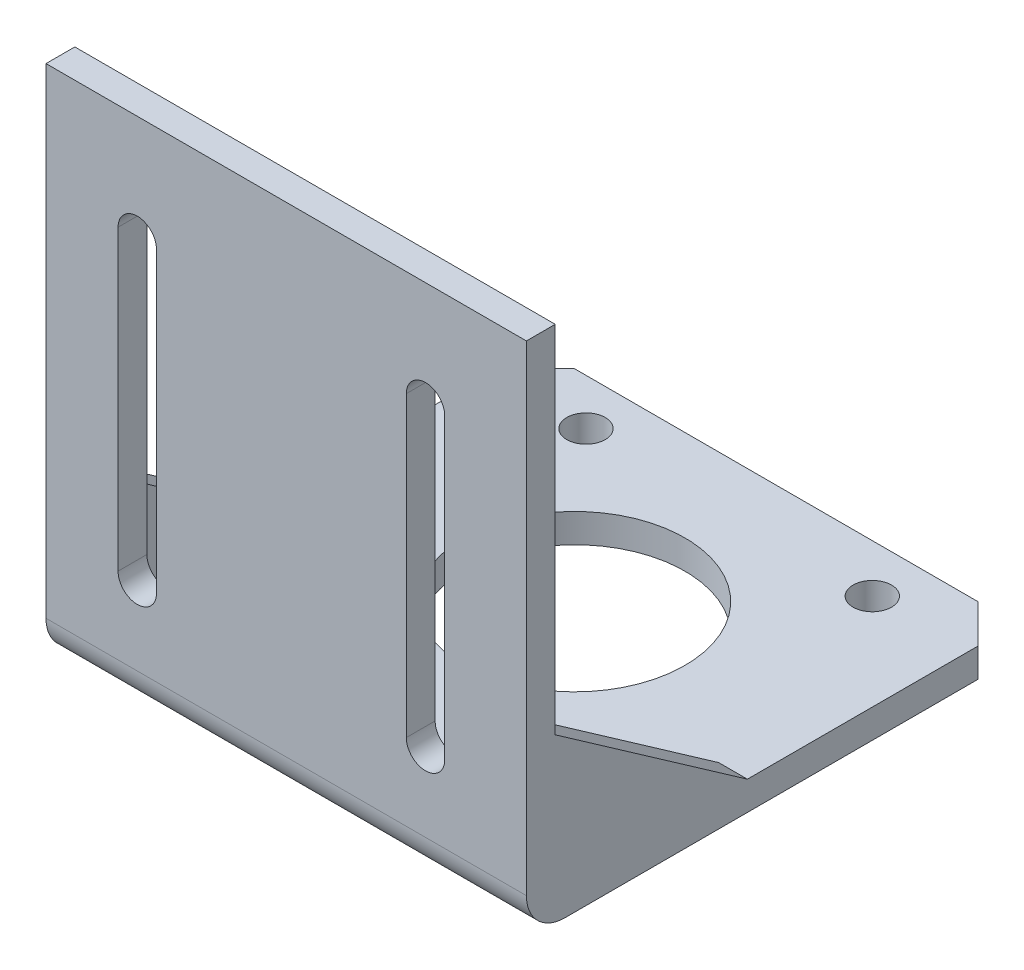
ISO-10303-21;
HEADER;
FILE_DESCRIPTION(('STEP AP214'),'2;1');
FILE_NAME('part.step','',(''),(''),'','','');
FILE_SCHEMA(('AUTOMOTIVE_DESIGN { 1 0 10303 214 1 1 1 1 }'));
ENDSEC;
DATA;
#1=APPLICATION_CONTEXT('core data for automotive mechanical design processes');
#2=APPLICATION_PROTOCOL_DEFINITION('international standard','automotive_design',2000,#1);
#3=PRODUCT_CONTEXT('',#1,'mechanical');
#4=PRODUCT('Part','Part','',(#3));
#5=PRODUCT_RELATED_PRODUCT_CATEGORY('part','',(#4));
#6=PRODUCT_DEFINITION_FORMATION('','',#4);
#7=PRODUCT_DEFINITION_CONTEXT('part definition',#1,'design');
#8=PRODUCT_DEFINITION('design','',#6,#7);
#9=PRODUCT_DEFINITION_SHAPE('','',#8);
#10=(LENGTH_UNIT() NAMED_UNIT(*) SI_UNIT(.MILLI.,.METRE.));
#11=(NAMED_UNIT(*) PLANE_ANGLE_UNIT() SI_UNIT($,.RADIAN.));
#12=(NAMED_UNIT(*) SI_UNIT($,.STERADIAN.) SOLID_ANGLE_UNIT());
#13=UNCERTAINTY_MEASURE_WITH_UNIT(LENGTH_MEASURE(1.E-05),#10,'distance_accuracy_value','');
#14=(GEOMETRIC_REPRESENTATION_CONTEXT(3) GLOBAL_UNCERTAINTY_ASSIGNED_CONTEXT((#13)) GLOBAL_UNIT_ASSIGNED_CONTEXT((#10,
#11,#12)) REPRESENTATION_CONTEXT('',''));
#15=CARTESIAN_POINT('',(0.,0.,0.));
#16=DIRECTION('',(0.,0.,1.));
#17=DIRECTION('',(1.,0.,0.));
#18=AXIS2_PLACEMENT_3D('',#15,#16,#17);
#19=CARTESIAN_POINT('',(0.,3.,0.));
#20=DIRECTION('',(0.,1.,0.));
#21=DIRECTION('',(0.,0.,1.));
#22=AXIS2_PLACEMENT_3D('',#19,#20,#21);
#23=PLANE('',#22);
#24=CARTESIAN_POINT('',(15.,3.,12.202380952381));
#25=DIRECTION('',(0.,1.,0.));
#26=DIRECTION('',(0.,0.,1.));
#27=AXIS2_PLACEMENT_3D('',#24,#25,#26);
#28=CIRCLE('',#27,2.);
#29=CARTESIAN_POINT('',(15.,3.,14.202380952381));
#30=VERTEX_POINT('',#29);
#31=EDGE_CURVE('E368',#30,#30,#28,.T.);
#32=ORIENTED_EDGE('',*,*,#31,.F.);
#33=EDGE_LOOP('',(#32));
#34=FACE_BOUND('',#33,.T.);
#35=CARTESIAN_POINT('',(-15.,3.,-19.));
#36=DIRECTION('',(0.,1.,0.));
#37=DIRECTION('',(0.,0.,1.));
#38=AXIS2_PLACEMENT_3D('',#35,#36,#37);
#39=CIRCLE('',#38,2.);
#40=CARTESIAN_POINT('',(-15.,3.,-17.));
#41=VERTEX_POINT('',#40);
#42=EDGE_CURVE('E384',#41,#41,#39,.T.);
#43=ORIENTED_EDGE('',*,*,#42,.F.);
#44=EDGE_LOOP('',(#43));
#45=FACE_BOUND('',#44,.T.);
#46=CARTESIAN_POINT('',(0.,3.,-2.79761904761905));
#47=DIRECTION('',(0.,1.,0.));
#48=DIRECTION('',(0.,0.,1.));
#49=AXIS2_PLACEMENT_3D('',#46,#47,#48);
#50=CIRCLE('',#49,11.5);
#51=CARTESIAN_POINT('',(0.,3.,8.70238095238095));
#52=VERTEX_POINT('',#51);
#53=EDGE_CURVE('E392',#52,#52,#50,.T.);
#54=ORIENTED_EDGE('',*,*,#53,.F.);
#55=EDGE_LOOP('',(#54));
#56=FACE_BOUND('',#55,.T.);
#57=CARTESIAN_POINT('',(15.,3.,-18.797619047619));
#58=DIRECTION('',(0.,1.,0.));
#59=DIRECTION('',(0.,0.,1.));
#60=AXIS2_PLACEMENT_3D('',#57,#58,#59);
#61=CIRCLE('',#60,2.00000000000001);
#62=CARTESIAN_POINT('',(15.,3.,-16.797619047619));
#63=VERTEX_POINT('',#62);
#64=EDGE_CURVE('E376',#63,#63,#61,.T.);
#65=ORIENTED_EDGE('',*,*,#64,.F.);
#66=EDGE_LOOP('',(#65));
#67=FACE_BOUND('',#66,.T.);
#68=CARTESIAN_POINT('',(-15.,3.,12.202380952381));
#69=DIRECTION('',(0.,1.,0.));
#70=DIRECTION('',(0.,0.,1.));
#71=AXIS2_PLACEMENT_3D('',#68,#69,#70);
#72=CIRCLE('',#71,2.);
#73=CARTESIAN_POINT('',(-15.,3.,14.202380952381));
#74=VERTEX_POINT('',#73);
#75=EDGE_CURVE('E360',#74,#74,#72,.T.);
#76=ORIENTED_EDGE('',*,*,#75,.F.);
#77=EDGE_LOOP('',(#76));
#78=FACE_BOUND('',#77,.T.);
#79=DIRECTION('',(0.,0.,1.));
#80=VECTOR('',#79,1.);
#81=CARTESIAN_POINT('',(-25.,3.,-19.7976190476191));
#82=LINE('',#81,#80);
#83=CARTESIAN_POINT('',(-25.,3.,-19.7976190476191));
#84=VERTEX_POINT('',#83);
#85=CARTESIAN_POINT('',(-25.,3.,4.20238095238095));
#86=VERTEX_POINT('',#85);
#87=EDGE_CURVE('E413',#84,#86,#82,.T.);
#88=ORIENTED_EDGE('',*,*,#87,.T.);
#89=DIRECTION('',(-1.,0.,0.));
#90=VECTOR('',#89,1.);
#91=CARTESIAN_POINT('',(-22.,3.,4.20238095238095));
#92=LINE('',#91,#90);
#93=CARTESIAN_POINT('',(-22.,3.,4.20238095238095));
#94=VERTEX_POINT('',#93);
#95=EDGE_CURVE('E209',#94,#86,#92,.T.);
#96=ORIENTED_EDGE('',*,*,#95,.F.);
#97=DIRECTION('',(0.,0.,-1.));
#98=VECTOR('',#97,1.);
#99=CARTESIAN_POINT('',(-22.,3.,4.20238095238095));
#100=LINE('',#99,#98);
#101=CARTESIAN_POINT('',(-22.,3.,22.202380952381));
#102=VERTEX_POINT('',#101);
#103=EDGE_CURVE('E195',#102,#94,#100,.T.);
#104=ORIENTED_EDGE('',*,*,#103,.F.);
#105=DIRECTION('',(1.,0.,0.));
#106=VECTOR('',#105,1.);
#107=CARTESIAN_POINT('',(25.,3.,22.202380952381));
#108=LINE('',#107,#106);
#109=CARTESIAN_POINT('',(22.,3.,22.202380952381));
#110=VERTEX_POINT('',#109);
#111=EDGE_CURVE('E457',#102,#110,#108,.T.);
#112=ORIENTED_EDGE('',*,*,#111,.T.);
#113=DIRECTION('',(0.,0.,-1.));
#114=VECTOR('',#113,1.);
#115=CARTESIAN_POINT('',(22.,3.,4.20238095238095));
#116=LINE('',#115,#114);
#117=CARTESIAN_POINT('',(22.,3.,4.20238095238095));
#118=VERTEX_POINT('',#117);
#119=EDGE_CURVE('E226',#110,#118,#116,.T.);
#120=ORIENTED_EDGE('',*,*,#119,.T.);
#121=DIRECTION('',(1.,0.,0.));
#122=VECTOR('',#121,1.);
#123=CARTESIAN_POINT('',(22.,3.,4.20238095238095));
#124=LINE('',#123,#122);
#125=CARTESIAN_POINT('',(25.,3.,4.20238095238095));
#126=VERTEX_POINT('',#125);
#127=EDGE_CURVE('E236',#118,#126,#124,.T.);
#128=ORIENTED_EDGE('',*,*,#127,.T.);
#129=DIRECTION('',(0.,0.,-1.));
#130=VECTOR('',#129,1.);
#131=CARTESIAN_POINT('',(25.,3.,-19.7976190476191));
#132=LINE('',#131,#130);
#133=CARTESIAN_POINT('',(25.,3.,-19.7976190476191));
#134=VERTEX_POINT('',#133);
#135=EDGE_CURVE('E400',#126,#134,#132,.T.);
#136=ORIENTED_EDGE('',*,*,#135,.T.);
#137=DIRECTION('',(-0.707106781186548,0.,-0.707106781186548));
#138=VECTOR('',#137,1.);
#139=CARTESIAN_POINT('',(21.,3.,-23.7976190476191));
#140=LINE('',#139,#138);
#141=CARTESIAN_POINT('',(21.,3.,-23.7976190476191));
#142=VERTEX_POINT('',#141);
#143=EDGE_CURVE('E403',#134,#142,#140,.T.);
#144=ORIENTED_EDGE('',*,*,#143,.T.);
#145=DIRECTION('',(-1.,0.,0.));
#146=VECTOR('',#145,1.);
#147=CARTESIAN_POINT('',(-21.,3.,-23.7976190476191));
#148=LINE('',#147,#146);
#149=CARTESIAN_POINT('',(-21.,3.,-23.7976190476191));
#150=VERTEX_POINT('',#149);
#151=EDGE_CURVE('E407',#142,#150,#148,.T.);
#152=ORIENTED_EDGE('',*,*,#151,.T.);
#153=DIRECTION('',(-0.707106781186548,0.,0.707106781186548));
#154=VECTOR('',#153,1.);
#155=CARTESIAN_POINT('',(-25.,3.,-19.7976190476191));
#156=LINE('',#155,#154);
#157=EDGE_CURVE('E410',#150,#84,#156,.T.);
#158=ORIENTED_EDGE('',*,*,#157,.T.);
#159=EDGE_LOOP('',(#88,#96,#104,#112,#120,#128,#136,#144,#152,#158));
#160=FACE_BOUND('',#159,.T.);
#161=ADVANCED_FACE('F39',(#34,#45,#56,#67,#78,#160),#23,.T.);
#162=CARTESIAN_POINT('',(0.,0.,24.202380952381));
#163=DIRECTION('',(0.,0.,-1.));
#164=DIRECTION('',(-1.,0.,0.));
#165=AXIS2_PLACEMENT_3D('',#162,#163,#164);
#166=PLANE('',#165);
#167=DIRECTION('',(0.,1.,0.));
#168=VECTOR('',#167,1.);
#169=CARTESIAN_POINT('',(16.5,43.,24.202380952381));
#170=LINE('',#169,#168);
#171=CARTESIAN_POINT('',(16.5,12.,24.202380952381));
#172=VERTEX_POINT('',#171);
#173=CARTESIAN_POINT('',(16.5,43.,24.202380952381));
#174=VERTEX_POINT('',#173);
#175=EDGE_CURVE('E251',#172,#174,#170,.T.);
#176=ORIENTED_EDGE('',*,*,#175,.T.);
#177=CARTESIAN_POINT('',(14.5,43.,24.202380952381));
#178=DIRECTION('',(0.,0.,1.));
#179=DIRECTION('',(-1.,0.,0.));
#180=AXIS2_PLACEMENT_3D('',#177,#178,#179);
#181=CIRCLE('',#180,2.);
#182=CARTESIAN_POINT('',(12.5,43.,24.202380952381));
#183=VERTEX_POINT('',#182);
#184=EDGE_CURVE('E243',#174,#183,#181,.T.);
#185=ORIENTED_EDGE('',*,*,#184,.T.);
#186=DIRECTION('',(0.,-1.,0.));
#187=VECTOR('',#186,1.);
#188=CARTESIAN_POINT('',(12.5,43.,24.202380952381));
#189=LINE('',#188,#187);
#190=CARTESIAN_POINT('',(12.5,12.,24.202380952381));
#191=VERTEX_POINT('',#190);
#192=EDGE_CURVE('E265',#183,#191,#189,.T.);
#193=ORIENTED_EDGE('',*,*,#192,.T.);
#194=CARTESIAN_POINT('',(14.5,12.,24.202380952381));
#195=DIRECTION('',(0.,0.,1.));
#196=DIRECTION('',(1.,0.,0.));
#197=AXIS2_PLACEMENT_3D('',#194,#195,#196);
#198=CIRCLE('',#197,2.00000000000001);
#199=EDGE_CURVE('E269',#191,#172,#198,.T.);
#200=ORIENTED_EDGE('',*,*,#199,.T.);
#201=EDGE_LOOP('',(#176,#185,#193,#200));
#202=FACE_BOUND('',#201,.T.);
#203=DIRECTION('',(0.,1.,0.));
#204=VECTOR('',#203,1.);
#205=CARTESIAN_POINT('',(-13.5,43.,24.202380952381));
#206=LINE('',#205,#204);
#207=CARTESIAN_POINT('',(-13.5,12.,24.202380952381));
#208=VERTEX_POINT('',#207);
#209=CARTESIAN_POINT('',(-13.5,43.,24.202380952381));
#210=VERTEX_POINT('',#209);
#211=EDGE_CURVE('E294',#208,#210,#206,.T.);
#212=ORIENTED_EDGE('',*,*,#211,.T.);
#213=CARTESIAN_POINT('',(-15.5,43.,24.202380952381));
#214=DIRECTION('',(0.,0.,1.));
#215=DIRECTION('',(-1.,0.,0.));
#216=AXIS2_PLACEMENT_3D('',#213,#214,#215);
#217=CIRCLE('',#216,2.);
#218=CARTESIAN_POINT('',(-17.5,43.,24.202380952381));
#219=VERTEX_POINT('',#218);
#220=EDGE_CURVE('E289',#210,#219,#217,.T.);
#221=ORIENTED_EDGE('',*,*,#220,.T.);
#222=DIRECTION('',(0.,-1.,0.));
#223=VECTOR('',#222,1.);
#224=CARTESIAN_POINT('',(-17.5,43.,24.202380952381));
#225=LINE('',#224,#223);
#226=CARTESIAN_POINT('',(-17.5,12.,24.202380952381));
#227=VERTEX_POINT('',#226);
#228=EDGE_CURVE('E308',#219,#227,#225,.T.);
#229=ORIENTED_EDGE('',*,*,#228,.T.);
#230=CARTESIAN_POINT('',(-15.5,12.,24.202380952381));
#231=DIRECTION('',(0.,0.,1.));
#232=DIRECTION('',(1.,0.,0.));
#233=AXIS2_PLACEMENT_3D('',#230,#231,#232);
#234=CIRCLE('',#233,2.);
#235=EDGE_CURVE('E312',#227,#208,#234,.T.);
#236=ORIENTED_EDGE('',*,*,#235,.T.);
#237=EDGE_LOOP('',(#212,#221,#229,#236));
#238=FACE_BOUND('',#237,.T.);
#239=DIRECTION('',(0.,-1.,0.));
#240=VECTOR('',#239,1.);
#241=CARTESIAN_POINT('',(-22.,3.,24.202380952381));
#242=LINE('',#241,#240);
#243=CARTESIAN_POINT('',(-22.,17.,24.202380952381));
#244=VERTEX_POINT('',#243);
#245=CARTESIAN_POINT('',(-22.,5.,24.202380952381));
#246=VERTEX_POINT('',#245);
#247=EDGE_CURVE('E193',#244,#246,#242,.T.);
#248=ORIENTED_EDGE('',*,*,#247,.F.);
#249=DIRECTION('',(-1.,0.,0.));
#250=VECTOR('',#249,1.);
#251=CARTESIAN_POINT('',(-22.,17.,24.202380952381));
#252=LINE('',#251,#250);
#253=CARTESIAN_POINT('',(-25.,17.,24.202380952381));
#254=VERTEX_POINT('',#253);
#255=EDGE_CURVE('E200',#244,#254,#252,.T.);
#256=ORIENTED_EDGE('',*,*,#255,.T.);
#257=DIRECTION('',(0.,-1.,0.));
#258=VECTOR('',#257,1.);
#259=CARTESIAN_POINT('',(-25.,0.,24.202380952381));
#260=LINE('',#259,#258);
#261=CARTESIAN_POINT('',(-25.,54.,24.202380952381));
#262=VERTEX_POINT('',#261);
#263=EDGE_CURVE('E337',#262,#254,#260,.T.);
#264=ORIENTED_EDGE('',*,*,#263,.F.);
#265=DIRECTION('',(-1.,0.,0.));
#266=VECTOR('',#265,1.);
#267=CARTESIAN_POINT('',(-25.,54.,24.202380952381));
#268=LINE('',#267,#266);
#269=CARTESIAN_POINT('',(25.,54.,24.202380952381));
#270=VERTEX_POINT('',#269);
#271=EDGE_CURVE('E347',#270,#262,#268,.T.);
#272=ORIENTED_EDGE('',*,*,#271,.F.);
#273=DIRECTION('',(0.,1.,0.));
#274=VECTOR('',#273,1.);
#275=CARTESIAN_POINT('',(25.,54.,24.202380952381));
#276=LINE('',#275,#274);
#277=CARTESIAN_POINT('',(25.,17.,24.202380952381));
#278=VERTEX_POINT('',#277);
#279=EDGE_CURVE('E332',#278,#270,#276,.T.);
#280=ORIENTED_EDGE('',*,*,#279,.F.);
#281=DIRECTION('',(1.,0.,0.));
#282=VECTOR('',#281,1.);
#283=CARTESIAN_POINT('',(22.,17.,24.202380952381));
#284=LINE('',#283,#282);
#285=CARTESIAN_POINT('',(22.,17.,24.202380952381));
#286=VERTEX_POINT('',#285);
#287=EDGE_CURVE('E240',#286,#278,#284,.T.);
#288=ORIENTED_EDGE('',*,*,#287,.F.);
#289=DIRECTION('',(0.,-1.,0.));
#290=VECTOR('',#289,1.);
#291=CARTESIAN_POINT('',(22.,3.,24.202380952381));
#292=LINE('',#291,#290);
#293=CARTESIAN_POINT('',(22.,5.,24.202380952381));
#294=VERTEX_POINT('',#293);
#295=EDGE_CURVE('E233',#286,#294,#292,.T.);
#296=ORIENTED_EDGE('',*,*,#295,.T.);
#297=DIRECTION('',(1.,0.,0.));
#298=VECTOR('',#297,1.);
#299=CARTESIAN_POINT('',(-25.,5.,24.202380952381));
#300=LINE('',#299,#298);
#301=EDGE_CURVE('E215',#294,#246,#300,.F.);
#302=ORIENTED_EDGE('',*,*,#301,.T.);
#303=EDGE_LOOP('',(#248,#256,#264,#272,#280,#288,#296,#302));
#304=FACE_BOUND('',#303,.T.);
#305=ADVANCED_FACE('F212',(#202,#238,#304),#166,.T.);
#306=CARTESIAN_POINT('',(0.,0.,0.));
#307=DIRECTION('',(0.,1.,0.));
#308=DIRECTION('',(0.,0.,1.));
#309=AXIS2_PLACEMENT_3D('',#306,#307,#308);
#310=PLANE('',#309);
#311=DIRECTION('',(0.,0.,-1.));
#312=VECTOR('',#311,1.);
#313=CARTESIAN_POINT('',(25.,0.,-19.7976190476191));
#314=LINE('',#313,#312);
#315=CARTESIAN_POINT('',(25.,0.,23.2023809523809));
#316=VERTEX_POINT('',#315);
#317=CARTESIAN_POINT('',(25.,0.,-19.7976190476191));
#318=VERTEX_POINT('',#317);
#319=EDGE_CURVE('E396',#316,#318,#314,.T.);
#320=ORIENTED_EDGE('',*,*,#319,.F.);
#321=DIRECTION('',(1.,0.,0.));
#322=VECTOR('',#321,1.);
#323=CARTESIAN_POINT('',(0.,0.,23.2023809523809));
#324=LINE('',#323,#322);
#325=CARTESIAN_POINT('',(-25.,0.,23.2023809523809));
#326=VERTEX_POINT('',#325);
#327=EDGE_CURVE('E55',#316,#326,#324,.F.);
#328=ORIENTED_EDGE('',*,*,#327,.T.);
#329=DIRECTION('',(0.,0.,1.));
#330=VECTOR('',#329,1.);
#331=CARTESIAN_POINT('',(-25.,0.,-19.7976190476191));
#332=LINE('',#331,#330);
#333=CARTESIAN_POINT('',(-25.,0.,-19.7976190476191));
#334=VERTEX_POINT('',#333);
#335=EDGE_CURVE('E404',#334,#326,#332,.T.);
#336=ORIENTED_EDGE('',*,*,#335,.F.);
#337=DIRECTION('',(-0.707106781186548,0.,0.707106781186548));
#338=VECTOR('',#337,1.);
#339=CARTESIAN_POINT('',(-25.,0.,-19.7976190476191));
#340=LINE('',#339,#338);
#341=CARTESIAN_POINT('',(-21.,0.,-23.7976190476191));
#342=VERTEX_POINT('',#341);
#343=EDGE_CURVE('E426',#342,#334,#340,.T.);
#344=ORIENTED_EDGE('',*,*,#343,.F.);
#345=DIRECTION('',(-1.,0.,0.));
#346=VECTOR('',#345,1.);
#347=CARTESIAN_POINT('',(-21.,0.,-23.7976190476191));
#348=LINE('',#347,#346);
#349=CARTESIAN_POINT('',(21.,0.,-23.7976190476191));
#350=VERTEX_POINT('',#349);
#351=EDGE_CURVE('E423',#350,#342,#348,.T.);
#352=ORIENTED_EDGE('',*,*,#351,.F.);
#353=DIRECTION('',(-0.707106781186548,0.,-0.707106781186548));
#354=VECTOR('',#353,1.);
#355=CARTESIAN_POINT('',(21.,0.,-23.7976190476191));
#356=LINE('',#355,#354);
#357=EDGE_CURVE('E420',#318,#350,#356,.T.);
#358=ORIENTED_EDGE('',*,*,#357,.F.);
#359=EDGE_LOOP('',(#320,#328,#336,#344,#352,#358));
#360=FACE_BOUND('',#359,.T.);
#361=CARTESIAN_POINT('',(0.,0.,-2.79761904761905));
#362=DIRECTION('',(0.,1.,0.));
#363=DIRECTION('',(0.,0.,1.));
#364=AXIS2_PLACEMENT_3D('',#361,#362,#363);
#365=CIRCLE('',#364,11.5);
#366=CARTESIAN_POINT('',(0.,0.,8.70238095238095));
#367=VERTEX_POINT('',#366);
#368=EDGE_CURVE('E388',#367,#367,#365,.T.);
#369=ORIENTED_EDGE('',*,*,#368,.T.);
#370=EDGE_LOOP('',(#369));
#371=FACE_BOUND('',#370,.T.);
#372=CARTESIAN_POINT('',(-15.,0.,-19.));
#373=DIRECTION('',(0.,1.,0.));
#374=DIRECTION('',(0.,0.,1.));
#375=AXIS2_PLACEMENT_3D('',#372,#373,#374);
#376=CIRCLE('',#375,2.);
#377=CARTESIAN_POINT('',(-15.,0.,-17.));
#378=VERTEX_POINT('',#377);
#379=EDGE_CURVE('E380',#378,#378,#376,.T.);
#380=ORIENTED_EDGE('',*,*,#379,.T.);
#381=EDGE_LOOP('',(#380));
#382=FACE_BOUND('',#381,.T.);
#383=CARTESIAN_POINT('',(15.,0.,-18.797619047619));
#384=DIRECTION('',(0.,1.,0.));
#385=DIRECTION('',(0.,0.,1.));
#386=AXIS2_PLACEMENT_3D('',#383,#384,#385);
#387=CIRCLE('',#386,2.00000000000001);
#388=CARTESIAN_POINT('',(15.,0.,-16.797619047619));
#389=VERTEX_POINT('',#388);
#390=EDGE_CURVE('E372',#389,#389,#387,.T.);
#391=ORIENTED_EDGE('',*,*,#390,.T.);
#392=EDGE_LOOP('',(#391));
#393=FACE_BOUND('',#392,.T.);
#394=CARTESIAN_POINT('',(15.,0.,12.202380952381));
#395=DIRECTION('',(0.,1.,0.));
#396=DIRECTION('',(0.,0.,1.));
#397=AXIS2_PLACEMENT_3D('',#394,#395,#396);
#398=CIRCLE('',#397,2.);
#399=CARTESIAN_POINT('',(15.,0.,14.202380952381));
#400=VERTEX_POINT('',#399);
#401=EDGE_CURVE('E364',#400,#400,#398,.T.);
#402=ORIENTED_EDGE('',*,*,#401,.T.);
#403=EDGE_LOOP('',(#402));
#404=FACE_BOUND('',#403,.T.);
#405=CARTESIAN_POINT('',(-15.,0.,12.202380952381));
#406=DIRECTION('',(0.,1.,0.));
#407=DIRECTION('',(0.,0.,1.));
#408=AXIS2_PLACEMENT_3D('',#405,#406,#407);
#409=CIRCLE('',#408,2.);
#410=CARTESIAN_POINT('',(-15.,0.,14.202380952381));
#411=VERTEX_POINT('',#410);
#412=EDGE_CURVE('E359',#411,#411,#409,.T.);
#413=ORIENTED_EDGE('',*,*,#412,.T.);
#414=EDGE_LOOP('',(#413));
#415=FACE_BOUND('',#414,.T.);
#416=ADVANCED_FACE('F510',(#360,#371,#382,#393,#404,#415),#310,.F.);
#417=CARTESIAN_POINT('',(25.,3.,-19.7976190476191));
#418=DIRECTION('',(-1.,0.,0.));
#419=DIRECTION('',(0.,0.,1.));
#420=AXIS2_PLACEMENT_3D('',#417,#418,#419);
#421=PLANE('',#420);
#422=ORIENTED_EDGE('',*,*,#135,.F.);
#423=DIRECTION('',(0.,0.573462344363328,0.819231920519041));
#424=VECTOR('',#423,1.);
#425=CARTESIAN_POINT('',(25.,17.,24.202380952381));
#426=LINE('',#425,#424);
#427=EDGE_CURVE('E224',#126,#278,#426,.T.);
#428=ORIENTED_EDGE('',*,*,#427,.T.);
#429=ORIENTED_EDGE('',*,*,#279,.T.);
#430=DIRECTION('',(0.,0.,-1.));
#431=VECTOR('',#430,1.);
#432=CARTESIAN_POINT('',(25.,54.,27.2023809523809));
#433=LINE('',#432,#431);
#434=CARTESIAN_POINT('',(25.,54.,27.2023809523809));
#435=VERTEX_POINT('',#434);
#436=EDGE_CURVE('E355',#435,#270,#433,.T.);
#437=ORIENTED_EDGE('',*,*,#436,.F.);
#438=DIRECTION('',(0.,1.,0.));
#439=VECTOR('',#438,1.);
#440=CARTESIAN_POINT('',(25.,54.,27.2023809523809));
#441=LINE('',#440,#439);
#442=CARTESIAN_POINT('',(25.,4.,27.2023809523809));
#443=VERTEX_POINT('',#442);
#444=EDGE_CURVE('E333',#443,#435,#441,.T.);
#445=ORIENTED_EDGE('',*,*,#444,.F.);
#446=CARTESIAN_POINT('',(25.,4.,23.2023809523809));
#447=DIRECTION('',(-1.,0.,0.));
#448=DIRECTION('',(0.,0.,1.));
#449=AXIS2_PLACEMENT_3D('',#446,#447,#448);
#450=CIRCLE('',#449,4.);
#451=EDGE_CURVE('E63',#443,#316,#450,.F.);
#452=ORIENTED_EDGE('',*,*,#451,.T.);
#453=ORIENTED_EDGE('',*,*,#319,.T.);
#454=DIRECTION('',(0.,-1.,0.));
#455=VECTOR('',#454,1.);
#456=CARTESIAN_POINT('',(25.,3.,-19.7976190476191));
#457=LINE('',#456,#455);
#458=EDGE_CURVE('E442',#134,#318,#457,.T.);
#459=ORIENTED_EDGE('',*,*,#458,.F.);
#460=EDGE_LOOP('',(#422,#428,#429,#437,#445,#452,#453,#459));
#461=FACE_BOUND('',#460,.T.);
#462=ADVANCED_FACE('F476',(#461),#421,.F.);
#463=CARTESIAN_POINT('',(21.,3.,-23.7976190476191));
#464=DIRECTION('',(-0.707106781186547,0.,0.707106781186547));
#465=DIRECTION('',(0.707106781186548,0.,0.707106781186548));
#466=AXIS2_PLACEMENT_3D('',#463,#464,#465);
#467=PLANE('',#466);
#468=ORIENTED_EDGE('',*,*,#357,.T.);
#469=DIRECTION('',(0.,-1.,0.));
#470=VECTOR('',#469,1.);
#471=CARTESIAN_POINT('',(21.,3.,-23.7976190476191));
#472=LINE('',#471,#470);
#473=EDGE_CURVE('E438',#142,#350,#472,.T.);
#474=ORIENTED_EDGE('',*,*,#473,.F.);
#475=ORIENTED_EDGE('',*,*,#143,.F.);
#476=ORIENTED_EDGE('',*,*,#458,.T.);
#477=EDGE_LOOP('',(#468,#474,#475,#476));
#478=FACE_BOUND('',#477,.T.);
#479=ADVANCED_FACE('F483',(#478),#467,.F.);
#480=CARTESIAN_POINT('',(-21.,3.,-23.7976190476191));
#481=DIRECTION('',(0.,0.,1.));
#482=DIRECTION('',(1.,0.,0.));
#483=AXIS2_PLACEMENT_3D('',#480,#481,#482);
#484=PLANE('',#483);
#485=ORIENTED_EDGE('',*,*,#351,.T.);
#486=DIRECTION('',(0.,-1.,0.));
#487=VECTOR('',#486,1.);
#488=CARTESIAN_POINT('',(-21.,3.,-23.7976190476191));
#489=LINE('',#488,#487);
#490=EDGE_CURVE('E434',#150,#342,#489,.T.);
#491=ORIENTED_EDGE('',*,*,#490,.F.);
#492=ORIENTED_EDGE('',*,*,#151,.F.);
#493=ORIENTED_EDGE('',*,*,#473,.T.);
#494=EDGE_LOOP('',(#485,#491,#492,#493));
#495=FACE_BOUND('',#494,.T.);
#496=ADVANCED_FACE('F489',(#495),#484,.F.);
#497=CARTESIAN_POINT('',(-25.,3.,-19.7976190476191));
#498=DIRECTION('',(0.707106781186547,0.,0.707106781186547));
#499=DIRECTION('',(0.707106781186548,0.,-0.707106781186548));
#500=AXIS2_PLACEMENT_3D('',#497,#498,#499);
#501=PLANE('',#500);
#502=ORIENTED_EDGE('',*,*,#343,.T.);
#503=DIRECTION('',(0.,-1.,0.));
#504=VECTOR('',#503,1.);
#505=CARTESIAN_POINT('',(-25.,3.,-19.7976190476191));
#506=LINE('',#505,#504);
#507=EDGE_CURVE('E417',#84,#334,#506,.T.);
#508=ORIENTED_EDGE('',*,*,#507,.F.);
#509=ORIENTED_EDGE('',*,*,#157,.F.);
#510=ORIENTED_EDGE('',*,*,#490,.T.);
#511=EDGE_LOOP('',(#502,#508,#509,#510));
#512=FACE_BOUND('',#511,.T.);
#513=ADVANCED_FACE('F494',(#512),#501,.F.);
#514=CARTESIAN_POINT('',(-25.,3.,-19.7976190476191));
#515=DIRECTION('',(1.,0.,0.));
#516=DIRECTION('',(0.,0.,-1.));
#517=AXIS2_PLACEMENT_3D('',#514,#515,#516);
#518=PLANE('',#517);
#519=DIRECTION('',(0.,0.573462344363328,0.819231920519041));
#520=VECTOR('',#519,1.);
#521=CARTESIAN_POINT('',(-25.,17.,24.202380952381));
#522=LINE('',#521,#520);
#523=EDGE_CURVE('E204',#86,#254,#522,.T.);
#524=ORIENTED_EDGE('',*,*,#523,.F.);
#525=ORIENTED_EDGE('',*,*,#87,.F.);
#526=ORIENTED_EDGE('',*,*,#507,.T.);
#527=ORIENTED_EDGE('',*,*,#335,.T.);
#528=CARTESIAN_POINT('',(-25.,4.,23.2023809523809));
#529=DIRECTION('',(1.,0.,0.));
#530=DIRECTION('',(0.,0.,-1.));
#531=AXIS2_PLACEMENT_3D('',#528,#529,#530);
#532=CIRCLE('',#531,4.);
#533=CARTESIAN_POINT('',(-25.,4.,27.2023809523809));
#534=VERTEX_POINT('',#533);
#535=EDGE_CURVE('E454',#326,#534,#532,.F.);
#536=ORIENTED_EDGE('',*,*,#535,.T.);
#537=DIRECTION('',(0.,-1.,0.));
#538=VECTOR('',#537,1.);
#539=CARTESIAN_POINT('',(-25.,0.,27.2023809523809));
#540=LINE('',#539,#538);
#541=CARTESIAN_POINT('',(-25.,54.,27.2023809523809));
#542=VERTEX_POINT('',#541);
#543=EDGE_CURVE('E340',#542,#534,#540,.T.);
#544=ORIENTED_EDGE('',*,*,#543,.F.);
#545=DIRECTION('',(0.,0.,-1.));
#546=VECTOR('',#545,1.);
#547=CARTESIAN_POINT('',(-25.,54.,27.2023809523809));
#548=LINE('',#547,#546);
#549=EDGE_CURVE('E344',#542,#262,#548,.T.);
#550=ORIENTED_EDGE('',*,*,#549,.T.);
#551=ORIENTED_EDGE('',*,*,#263,.T.);
#552=EDGE_LOOP('',(#524,#525,#526,#527,#536,#544,#550,#551));
#553=FACE_BOUND('',#552,.T.);
#554=ADVANCED_FACE('F497',(#553),#518,.F.);
#555=CARTESIAN_POINT('',(0.,3.,-2.79761904761905));
#556=DIRECTION('',(0.,-1.,0.));
#557=DIRECTION('',(0.,0.,-1.));
#558=AXIS2_PLACEMENT_3D('',#555,#556,#557);
#559=CYLINDRICAL_SURFACE('',#558,11.5);
#560=ORIENTED_EDGE('',*,*,#53,.T.);
#561=EDGE_LOOP('',(#560));
#562=FACE_BOUND('',#561,.T.);
#563=ORIENTED_EDGE('',*,*,#368,.F.);
#564=EDGE_LOOP('',(#563));
#565=FACE_BOUND('',#564,.T.);
#566=ADVANCED_FACE('F551',(#562,#565),#559,.F.);
#567=CARTESIAN_POINT('',(-15.,3.,-19.));
#568=DIRECTION('',(0.,-1.,0.));
#569=DIRECTION('',(0.,0.,-1.));
#570=AXIS2_PLACEMENT_3D('',#567,#568,#569);
#571=CYLINDRICAL_SURFACE('',#570,2.);
#572=ORIENTED_EDGE('',*,*,#42,.T.);
#573=EDGE_LOOP('',(#572));
#574=FACE_BOUND('',#573,.T.);
#575=ORIENTED_EDGE('',*,*,#379,.F.);
#576=EDGE_LOOP('',(#575));
#577=FACE_BOUND('',#576,.T.);
#578=ADVANCED_FACE('F753',(#574,#577),#571,.F.);
#579=CARTESIAN_POINT('',(15.,3.,-18.797619047619));
#580=DIRECTION('',(0.,-1.,0.));
#581=DIRECTION('',(0.,0.,-1.));
#582=AXIS2_PLACEMENT_3D('',#579,#580,#581);
#583=CYLINDRICAL_SURFACE('',#582,2.00000000000001);
#584=ORIENTED_EDGE('',*,*,#64,.T.);
#585=EDGE_LOOP('',(#584));
#586=FACE_BOUND('',#585,.T.);
#587=ORIENTED_EDGE('',*,*,#390,.F.);
#588=EDGE_LOOP('',(#587));
#589=FACE_BOUND('',#588,.T.);
#590=ADVANCED_FACE('F535',(#586,#589),#583,.F.);
#591=CARTESIAN_POINT('',(15.,3.,12.202380952381));
#592=DIRECTION('',(0.,-1.,0.));
#593=DIRECTION('',(0.,0.,-1.));
#594=AXIS2_PLACEMENT_3D('',#591,#592,#593);
#595=CYLINDRICAL_SURFACE('',#594,2.);
#596=ORIENTED_EDGE('',*,*,#31,.T.);
#597=EDGE_LOOP('',(#596));
#598=FACE_BOUND('',#597,.T.);
#599=ORIENTED_EDGE('',*,*,#401,.F.);
#600=EDGE_LOOP('',(#599));
#601=FACE_BOUND('',#600,.T.);
#602=ADVANCED_FACE('F526',(#598,#601),#595,.F.);
#603=CARTESIAN_POINT('',(-15.,3.,12.202380952381));
#604=DIRECTION('',(0.,-1.,0.));
#605=DIRECTION('',(0.,0.,-1.));
#606=AXIS2_PLACEMENT_3D('',#603,#604,#605);
#607=CYLINDRICAL_SURFACE('',#606,2.);
#608=ORIENTED_EDGE('',*,*,#75,.T.);
#609=EDGE_LOOP('',(#608));
#610=FACE_BOUND('',#609,.T.);
#611=ORIENTED_EDGE('',*,*,#412,.F.);
#612=EDGE_LOOP('',(#611));
#613=FACE_BOUND('',#612,.T.);
#614=ADVANCED_FACE('F524',(#610,#613),#607,.F.);
#615=CARTESIAN_POINT('',(0.,0.,27.2023809523809));
#616=DIRECTION('',(0.,0.,-1.));
#617=DIRECTION('',(-1.,0.,0.));
#618=AXIS2_PLACEMENT_3D('',#615,#616,#617);
#619=PLANE('',#618);
#620=CARTESIAN_POINT('',(-15.5,43.,27.2023809523809));
#621=DIRECTION('',(0.,0.,1.));
#622=DIRECTION('',(-1.,0.,0.));
#623=AXIS2_PLACEMENT_3D('',#620,#621,#622);
#624=CIRCLE('',#623,2.);
#625=CARTESIAN_POINT('',(-13.5,43.,27.2023809523809));
#626=VERTEX_POINT('',#625);
#627=CARTESIAN_POINT('',(-17.5,43.,27.2023809523809));
#628=VERTEX_POINT('',#627);
#629=EDGE_CURVE('E290',#626,#628,#624,.T.);
#630=ORIENTED_EDGE('',*,*,#629,.F.);
#631=DIRECTION('',(0.,1.,0.));
#632=VECTOR('',#631,1.);
#633=CARTESIAN_POINT('',(-13.5,43.,27.2023809523809));
#634=LINE('',#633,#632);
#635=CARTESIAN_POINT('',(-13.5,12.,27.2023809523809));
#636=VERTEX_POINT('',#635);
#637=EDGE_CURVE('E301',#636,#626,#634,.T.);
#638=ORIENTED_EDGE('',*,*,#637,.F.);
#639=CARTESIAN_POINT('',(-15.5,12.,27.2023809523809));
#640=DIRECTION('',(0.,0.,1.));
#641=DIRECTION('',(1.,0.,0.));
#642=AXIS2_PLACEMENT_3D('',#639,#640,#641);
#643=CIRCLE('',#642,2.);
#644=CARTESIAN_POINT('',(-17.5,12.,27.2023809523809));
#645=VERTEX_POINT('',#644);
#646=EDGE_CURVE('E297',#645,#636,#643,.T.);
#647=ORIENTED_EDGE('',*,*,#646,.F.);
#648=DIRECTION('',(0.,-1.,0.));
#649=VECTOR('',#648,1.);
#650=CARTESIAN_POINT('',(-17.5,43.,27.2023809523809));
#651=LINE('',#650,#649);
#652=EDGE_CURVE('E293',#628,#645,#651,.T.);
#653=ORIENTED_EDGE('',*,*,#652,.F.);
#654=EDGE_LOOP('',(#630,#638,#647,#653));
#655=FACE_BOUND('',#654,.T.);
#656=ORIENTED_EDGE('',*,*,#543,.T.);
#657=DIRECTION('',(1.,0.,0.));
#658=VECTOR('',#657,1.);
#659=CARTESIAN_POINT('',(0.,4.,27.2023809523809));
#660=LINE('',#659,#658);
#661=EDGE_CURVE('E446',#534,#443,#660,.T.);
#662=ORIENTED_EDGE('',*,*,#661,.T.);
#663=ORIENTED_EDGE('',*,*,#444,.T.);
#664=DIRECTION('',(-1.,0.,0.));
#665=VECTOR('',#664,1.);
#666=CARTESIAN_POINT('',(-25.,54.,27.2023809523809));
#667=LINE('',#666,#665);
#668=EDGE_CURVE('E336',#435,#542,#667,.T.);
#669=ORIENTED_EDGE('',*,*,#668,.T.);
#670=EDGE_LOOP('',(#656,#662,#663,#669));
#671=FACE_BOUND('',#670,.T.);
#672=CARTESIAN_POINT('',(14.5,43.,27.2023809523809));
#673=DIRECTION('',(0.,0.,1.));
#674=DIRECTION('',(-1.,0.,0.));
#675=AXIS2_PLACEMENT_3D('',#672,#673,#674);
#676=CIRCLE('',#675,2.);
#677=CARTESIAN_POINT('',(16.5,43.,27.2023809523809));
#678=VERTEX_POINT('',#677);
#679=CARTESIAN_POINT('',(12.5,43.,27.2023809523809));
#680=VERTEX_POINT('',#679);
#681=EDGE_CURVE('E247',#678,#680,#676,.T.);
#682=ORIENTED_EDGE('',*,*,#681,.F.);
#683=DIRECTION('',(0.,1.,0.));
#684=VECTOR('',#683,1.);
#685=CARTESIAN_POINT('',(16.5,43.,27.2023809523809));
#686=LINE('',#685,#684);
#687=CARTESIAN_POINT('',(16.5,12.,27.2023809523809));
#688=VERTEX_POINT('',#687);
#689=EDGE_CURVE('E258',#688,#678,#686,.T.);
#690=ORIENTED_EDGE('',*,*,#689,.F.);
#691=CARTESIAN_POINT('',(14.5,12.,27.2023809523809));
#692=DIRECTION('',(0.,0.,1.));
#693=DIRECTION('',(1.,0.,0.));
#694=AXIS2_PLACEMENT_3D('',#691,#692,#693);
#695=CIRCLE('',#694,2.00000000000001);
#696=CARTESIAN_POINT('',(12.5,12.,27.2023809523809));
#697=VERTEX_POINT('',#696);
#698=EDGE_CURVE('E254',#697,#688,#695,.T.);
#699=ORIENTED_EDGE('',*,*,#698,.F.);
#700=DIRECTION('',(0.,-1.,0.));
#701=VECTOR('',#700,1.);
#702=CARTESIAN_POINT('',(12.5,43.,27.2023809523809));
#703=LINE('',#702,#701);
#704=EDGE_CURVE('E250',#680,#697,#703,.T.);
#705=ORIENTED_EDGE('',*,*,#704,.F.);
#706=EDGE_LOOP('',(#682,#690,#699,#705));
#707=FACE_BOUND('',#706,.T.);
#708=ADVANCED_FACE('F504',(#655,#671,#707),#619,.F.);
#709=CARTESIAN_POINT('',(-25.,54.,27.2023809523809));
#710=DIRECTION('',(0.,-1.,0.));
#711=DIRECTION('',(0.,0.,-1.));
#712=AXIS2_PLACEMENT_3D('',#709,#710,#711);
#713=PLANE('',#712);
#714=ORIENTED_EDGE('',*,*,#271,.T.);
#715=ORIENTED_EDGE('',*,*,#549,.F.);
#716=ORIENTED_EDGE('',*,*,#668,.F.);
#717=ORIENTED_EDGE('',*,*,#436,.T.);
#718=EDGE_LOOP('',(#714,#715,#716,#717));
#719=FACE_BOUND('',#718,.T.);
#720=ADVANCED_FACE('F501',(#719),#713,.F.);
#721=CARTESIAN_POINT('',(-15.5,43.,27.2023809523809));
#722=DIRECTION('',(0.,0.,-1.));
#723=DIRECTION('',(-1.,0.,0.));
#724=AXIS2_PLACEMENT_3D('',#721,#722,#723);
#725=CYLINDRICAL_SURFACE('',#724,2.);
#726=ORIENTED_EDGE('',*,*,#220,.F.);
#727=DIRECTION('',(0.,0.,-1.));
#728=VECTOR('',#727,1.);
#729=CARTESIAN_POINT('',(-13.5,43.,27.2023809523809));
#730=LINE('',#729,#728);
#731=EDGE_CURVE('E304',#626,#210,#730,.T.);
#732=ORIENTED_EDGE('',*,*,#731,.F.);
#733=ORIENTED_EDGE('',*,*,#629,.T.);
#734=DIRECTION('',(0.,0.,-1.));
#735=VECTOR('',#734,1.);
#736=CARTESIAN_POINT('',(-17.5,43.,27.2023809523809));
#737=LINE('',#736,#735);
#738=EDGE_CURVE('E328',#628,#219,#737,.T.);
#739=ORIENTED_EDGE('',*,*,#738,.T.);
#740=EDGE_LOOP('',(#726,#732,#733,#739));
#741=FACE_BOUND('',#740,.T.);
#742=ADVANCED_FACE('F601',(#741),#725,.F.);
#743=CARTESIAN_POINT('',(-17.5,43.,27.2023809523809));
#744=DIRECTION('',(1.,0.,0.));
#745=DIRECTION('',(0.,1.,0.));
#746=AXIS2_PLACEMENT_3D('',#743,#744,#745);
#747=PLANE('',#746);
#748=ORIENTED_EDGE('',*,*,#228,.F.);
#749=ORIENTED_EDGE('',*,*,#738,.F.);
#750=ORIENTED_EDGE('',*,*,#652,.T.);
#751=DIRECTION('',(0.,0.,-1.));
#752=VECTOR('',#751,1.);
#753=CARTESIAN_POINT('',(-17.5,12.,27.2023809523809));
#754=LINE('',#753,#752);
#755=EDGE_CURVE('E325',#645,#227,#754,.T.);
#756=ORIENTED_EDGE('',*,*,#755,.T.);
#757=EDGE_LOOP('',(#748,#749,#750,#756));
#758=FACE_BOUND('',#757,.T.);
#759=ADVANCED_FACE('F597',(#758),#747,.T.);
#760=CARTESIAN_POINT('',(-15.5,12.,27.2023809523809));
#761=DIRECTION('',(0.,0.,-1.));
#762=DIRECTION('',(-1.,0.,0.));
#763=AXIS2_PLACEMENT_3D('',#760,#761,#762);
#764=CYLINDRICAL_SURFACE('',#763,2.);
#765=ORIENTED_EDGE('',*,*,#235,.F.);
#766=ORIENTED_EDGE('',*,*,#755,.F.);
#767=ORIENTED_EDGE('',*,*,#646,.T.);
#768=DIRECTION('',(0.,0.,-1.));
#769=VECTOR('',#768,1.);
#770=CARTESIAN_POINT('',(-13.5,12.,27.2023809523809));
#771=LINE('',#770,#769);
#772=EDGE_CURVE('E322',#636,#208,#771,.T.);
#773=ORIENTED_EDGE('',*,*,#772,.T.);
#774=EDGE_LOOP('',(#765,#766,#767,#773));
#775=FACE_BOUND('',#774,.T.);
#776=ADVANCED_FACE('F593',(#775),#764,.F.);
#777=CARTESIAN_POINT('',(-13.5,43.,27.2023809523809));
#778=DIRECTION('',(-1.,0.,0.));
#779=DIRECTION('',(0.,-1.,0.));
#780=AXIS2_PLACEMENT_3D('',#777,#778,#779);
#781=PLANE('',#780);
#782=ORIENTED_EDGE('',*,*,#211,.F.);
#783=ORIENTED_EDGE('',*,*,#772,.F.);
#784=ORIENTED_EDGE('',*,*,#637,.T.);
#785=ORIENTED_EDGE('',*,*,#731,.T.);
#786=EDGE_LOOP('',(#782,#783,#784,#785));
#787=FACE_BOUND('',#786,.T.);
#788=ADVANCED_FACE('F589',(#787),#781,.T.);
#789=CARTESIAN_POINT('',(14.5,43.,27.2023809523809));
#790=DIRECTION('',(0.,0.,-1.));
#791=DIRECTION('',(-1.,0.,0.));
#792=AXIS2_PLACEMENT_3D('',#789,#790,#791);
#793=CYLINDRICAL_SURFACE('',#792,2.);
#794=ORIENTED_EDGE('',*,*,#184,.F.);
#795=DIRECTION('',(0.,0.,-1.));
#796=VECTOR('',#795,1.);
#797=CARTESIAN_POINT('',(16.5,43.,27.2023809523809));
#798=LINE('',#797,#796);
#799=EDGE_CURVE('E261',#678,#174,#798,.T.);
#800=ORIENTED_EDGE('',*,*,#799,.F.);
#801=ORIENTED_EDGE('',*,*,#681,.T.);
#802=DIRECTION('',(0.,0.,-1.));
#803=VECTOR('',#802,1.);
#804=CARTESIAN_POINT('',(12.5,43.,27.2023809523809));
#805=LINE('',#804,#803);
#806=EDGE_CURVE('E285',#680,#183,#805,.T.);
#807=ORIENTED_EDGE('',*,*,#806,.T.);
#808=EDGE_LOOP('',(#794,#800,#801,#807));
#809=FACE_BOUND('',#808,.T.);
#810=ADVANCED_FACE('F585',(#809),#793,.F.);
#811=CARTESIAN_POINT('',(12.5,43.,27.2023809523809));
#812=DIRECTION('',(1.,0.,0.));
#813=DIRECTION('',(0.,1.,0.));
#814=AXIS2_PLACEMENT_3D('',#811,#812,#813);
#815=PLANE('',#814);
#816=ORIENTED_EDGE('',*,*,#192,.F.);
#817=ORIENTED_EDGE('',*,*,#806,.F.);
#818=ORIENTED_EDGE('',*,*,#704,.T.);
#819=DIRECTION('',(0.,0.,-1.));
#820=VECTOR('',#819,1.);
#821=CARTESIAN_POINT('',(12.5,12.,27.2023809523809));
#822=LINE('',#821,#820);
#823=EDGE_CURVE('E282',#697,#191,#822,.T.);
#824=ORIENTED_EDGE('',*,*,#823,.T.);
#825=EDGE_LOOP('',(#816,#817,#818,#824));
#826=FACE_BOUND('',#825,.T.);
#827=ADVANCED_FACE('F576',(#826),#815,.T.);
#828=CARTESIAN_POINT('',(14.5,12.,27.2023809523809));
#829=DIRECTION('',(0.,0.,-1.));
#830=DIRECTION('',(-1.,0.,0.));
#831=AXIS2_PLACEMENT_3D('',#828,#829,#830);
#832=CYLINDRICAL_SURFACE('',#831,2.00000000000001);
#833=ORIENTED_EDGE('',*,*,#199,.F.);
#834=ORIENTED_EDGE('',*,*,#823,.F.);
#835=ORIENTED_EDGE('',*,*,#698,.T.);
#836=DIRECTION('',(0.,0.,-1.));
#837=VECTOR('',#836,1.);
#838=CARTESIAN_POINT('',(16.5,12.,27.2023809523809));
#839=LINE('',#838,#837);
#840=EDGE_CURVE('E279',#688,#172,#839,.T.);
#841=ORIENTED_EDGE('',*,*,#840,.T.);
#842=EDGE_LOOP('',(#833,#834,#835,#841));
#843=FACE_BOUND('',#842,.T.);
#844=ADVANCED_FACE('F570',(#843),#832,.F.);
#845=CARTESIAN_POINT('',(16.5,43.,27.2023809523809));
#846=DIRECTION('',(-1.,0.,0.));
#847=DIRECTION('',(0.,-1.,0.));
#848=AXIS2_PLACEMENT_3D('',#845,#846,#847);
#849=PLANE('',#848);
#850=ORIENTED_EDGE('',*,*,#175,.F.);
#851=ORIENTED_EDGE('',*,*,#840,.F.);
#852=ORIENTED_EDGE('',*,*,#689,.T.);
#853=ORIENTED_EDGE('',*,*,#799,.T.);
#854=EDGE_LOOP('',(#850,#851,#852,#853));
#855=FACE_BOUND('',#854,.T.);
#856=ADVANCED_FACE('F564',(#855),#849,.T.);
#857=CARTESIAN_POINT('',(0.,4.,23.2023809523809));
#858=DIRECTION('',(1.,0.,0.));
#859=DIRECTION('',(0.,0.,-1.));
#860=AXIS2_PLACEMENT_3D('',#857,#858,#859);
#861=CYLINDRICAL_SURFACE('',#860,4.);
#862=ORIENTED_EDGE('',*,*,#535,.F.);
#863=ORIENTED_EDGE('',*,*,#327,.F.);
#864=ORIENTED_EDGE('',*,*,#451,.F.);
#865=ORIENTED_EDGE('',*,*,#661,.F.);
#866=EDGE_LOOP('',(#862,#863,#864,#865));
#867=FACE_BOUND('',#866,.T.);
#868=ADVANCED_FACE('F509',(#867),#861,.T.);
#869=CARTESIAN_POINT('',(0.,5.,22.202380952381));
#870=DIRECTION('',(-1.,0.,0.));
#871=DIRECTION('',(0.,0.,1.));
#872=AXIS2_PLACEMENT_3D('',#869,#870,#871);
#873=CYLINDRICAL_SURFACE('',#872,2.);
#874=ORIENTED_EDGE('',*,*,#111,.F.);
#875=CARTESIAN_POINT('',(-22.,5.,22.202380952381));
#876=DIRECTION('',(1.,0.,0.));
#877=DIRECTION('',(0.,0.,-1.));
#878=AXIS2_PLACEMENT_3D('',#875,#876,#877);
#879=CIRCLE('',#878,2.);
#880=EDGE_CURVE('E11',#102,#246,#879,.F.);
#881=ORIENTED_EDGE('',*,*,#880,.T.);
#882=ORIENTED_EDGE('',*,*,#301,.F.);
#883=CARTESIAN_POINT('',(22.,5.,22.202380952381));
#884=DIRECTION('',(-1.,0.,0.));
#885=DIRECTION('',(0.,0.,1.));
#886=AXIS2_PLACEMENT_3D('',#883,#884,#885);
#887=CIRCLE('',#886,2.);
#888=EDGE_CURVE('E48',#294,#110,#887,.F.);
#889=ORIENTED_EDGE('',*,*,#888,.T.);
#890=EDGE_LOOP('',(#874,#881,#882,#889));
#891=FACE_BOUND('',#890,.T.);
#892=ADVANCED_FACE('F41',(#891),#873,.F.);
#893=CARTESIAN_POINT('',(22.,0.,0.));
#894=DIRECTION('',(-1.,0.,0.));
#895=DIRECTION('',(0.,0.,1.));
#896=AXIS2_PLACEMENT_3D('',#893,#894,#895);
#897=PLANE('',#896);
#898=ORIENTED_EDGE('',*,*,#888,.F.);
#899=ORIENTED_EDGE('',*,*,#295,.F.);
#900=DIRECTION('',(0.,0.573462344363328,0.819231920519041));
#901=VECTOR('',#900,1.);
#902=CARTESIAN_POINT('',(22.,17.,24.202380952381));
#903=LINE('',#902,#901);
#904=EDGE_CURVE('E230',#118,#286,#903,.T.);
#905=ORIENTED_EDGE('',*,*,#904,.F.);
#906=ORIENTED_EDGE('',*,*,#119,.F.);
#907=EDGE_LOOP('',(#898,#899,#905,#906));
#908=FACE_BOUND('',#907,.T.);
#909=ADVANCED_FACE('F468',(#908),#897,.T.);
#910=CARTESIAN_POINT('',(22.,17.,24.202380952381));
#911=DIRECTION('',(0.,0.81923192051904,-0.573462344363328));
#912=DIRECTION('',(0.,0.573462344363328,0.819231920519041));
#913=AXIS2_PLACEMENT_3D('',#910,#911,#912);
#914=PLANE('',#913);
#915=ORIENTED_EDGE('',*,*,#427,.F.);
#916=ORIENTED_EDGE('',*,*,#127,.F.);
#917=ORIENTED_EDGE('',*,*,#904,.T.);
#918=ORIENTED_EDGE('',*,*,#287,.T.);
#919=EDGE_LOOP('',(#915,#916,#917,#918));
#920=FACE_BOUND('',#919,.T.);
#921=ADVANCED_FACE('F474',(#920),#914,.T.);
#922=CARTESIAN_POINT('',(-22.,0.,0.));
#923=DIRECTION('',(1.,0.,0.));
#924=DIRECTION('',(0.,0.,1.));
#925=AXIS2_PLACEMENT_3D('',#922,#923,#924);
#926=PLANE('',#925);
#927=ORIENTED_EDGE('',*,*,#880,.F.);
#928=ORIENTED_EDGE('',*,*,#103,.T.);
#929=DIRECTION('',(0.,0.573462344363328,0.819231920519041));
#930=VECTOR('',#929,1.);
#931=CARTESIAN_POINT('',(-22.,17.,24.202380952381));
#932=LINE('',#931,#930);
#933=EDGE_CURVE('E189',#94,#244,#932,.T.);
#934=ORIENTED_EDGE('',*,*,#933,.T.);
#935=ORIENTED_EDGE('',*,*,#247,.T.);
#936=EDGE_LOOP('',(#927,#928,#934,#935));
#937=FACE_BOUND('',#936,.T.);
#938=ADVANCED_FACE('F191',(#937),#926,.T.);
#939=CARTESIAN_POINT('',(-22.,17.,24.202380952381));
#940=DIRECTION('',(0.,-0.81923192051904,0.573462344363328));
#941=DIRECTION('',(0.,-0.573462344363328,-0.819231920519041));
#942=AXIS2_PLACEMENT_3D('',#939,#940,#941);
#943=PLANE('',#942);
#944=ORIENTED_EDGE('',*,*,#523,.T.);
#945=ORIENTED_EDGE('',*,*,#255,.F.);
#946=ORIENTED_EDGE('',*,*,#933,.F.);
#947=ORIENTED_EDGE('',*,*,#95,.T.);
#948=EDGE_LOOP('',(#944,#945,#946,#947));
#949=FACE_BOUND('',#948,.T.);
#950=ADVANCED_FACE('F203',(#949),#943,.F.);
#951=CLOSED_SHELL('',(#161,#305,#416,#462,#479,#496,#513,#554,#566,#578,#590,#602,#614,#708,
#720,#742,#759,#776,#788,#810,#827,#844,#856,#868,#892,#909,#921,#938,#950));
#952=MANIFOLD_SOLID_BREP('B2',#951);
#953=ADVANCED_BREP_SHAPE_REPRESENTATION('',(#18,#952),#14);
#954=SHAPE_DEFINITION_REPRESENTATION(#9,#953);
ENDSEC;
END-ISO-10303-21;
